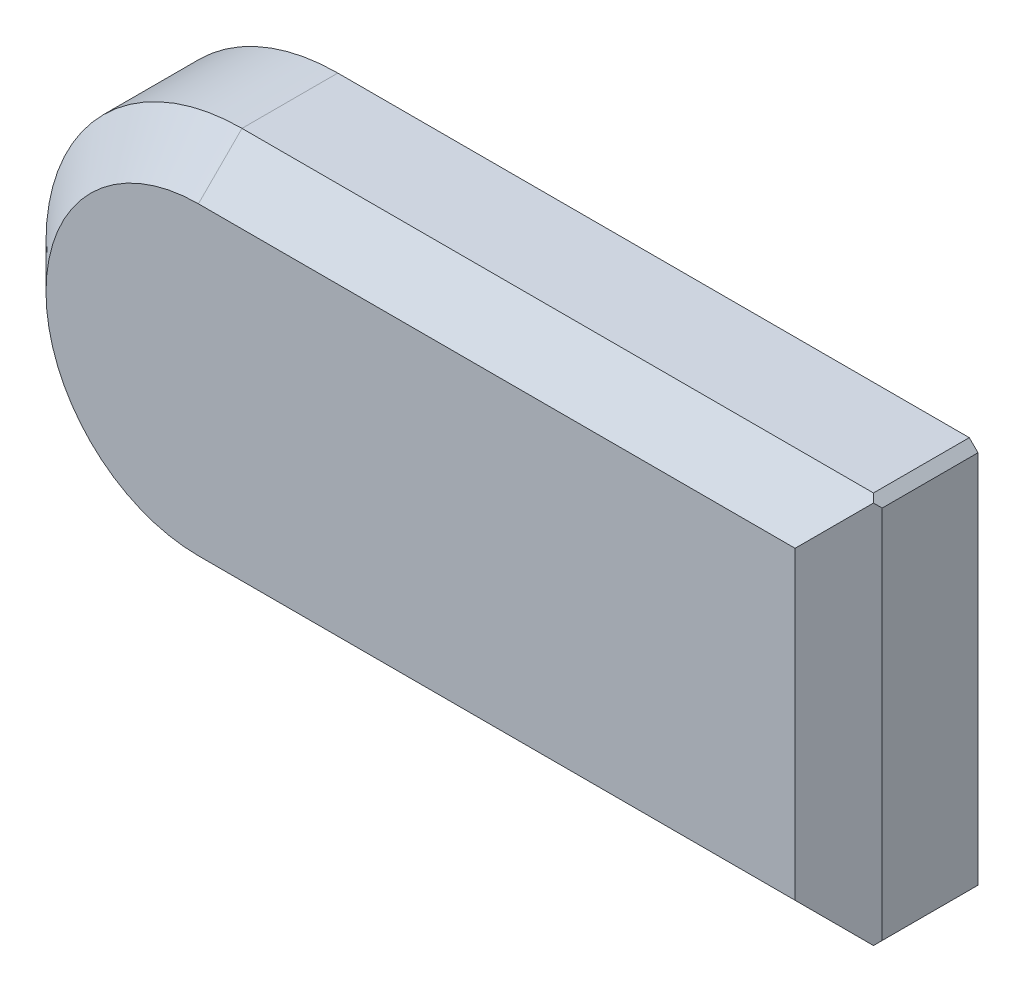
ISO-10303-21;
HEADER;
FILE_DESCRIPTION(('STEP AP214'),'2;1');
FILE_NAME('part.step','',(''),(''),'','','');
FILE_SCHEMA(('AUTOMOTIVE_DESIGN { 1 0 10303 214 1 1 1 1 }'));
ENDSEC;
DATA;
#1=APPLICATION_CONTEXT('core data for automotive mechanical design processes');
#2=APPLICATION_PROTOCOL_DEFINITION('international standard','automotive_design',2000,#1);
#3=PRODUCT_CONTEXT('',#1,'mechanical');
#4=PRODUCT('Part','Part','',(#3));
#5=PRODUCT_RELATED_PRODUCT_CATEGORY('part','',(#4));
#6=PRODUCT_DEFINITION_FORMATION('','',#4);
#7=PRODUCT_DEFINITION_CONTEXT('part definition',#1,'design');
#8=PRODUCT_DEFINITION('design','',#6,#7);
#9=PRODUCT_DEFINITION_SHAPE('','',#8);
#10=(LENGTH_UNIT() NAMED_UNIT(*) SI_UNIT(.MILLI.,.METRE.));
#11=(NAMED_UNIT(*) PLANE_ANGLE_UNIT() SI_UNIT($,.RADIAN.));
#12=(NAMED_UNIT(*) SI_UNIT($,.STERADIAN.) SOLID_ANGLE_UNIT());
#13=UNCERTAINTY_MEASURE_WITH_UNIT(LENGTH_MEASURE(1.E-05),#10,'distance_accuracy_value','');
#14=(GEOMETRIC_REPRESENTATION_CONTEXT(3) GLOBAL_UNCERTAINTY_ASSIGNED_CONTEXT((#13)) GLOBAL_UNIT_ASSIGNED_CONTEXT((#10,
#11,#12)) REPRESENTATION_CONTEXT('',''));
#15=CARTESIAN_POINT('',(0.,0.,0.));
#16=DIRECTION('',(0.,0.,1.));
#17=DIRECTION('',(1.,0.,0.));
#18=AXIS2_PLACEMENT_3D('',#15,#16,#17);
#19=CARTESIAN_POINT('',(-36.75,0.,16.));
#20=DIRECTION('',(0.,0.,-1.));
#21=DIRECTION('',(-1.,0.,0.));
#22=AXIS2_PLACEMENT_3D('',#19,#20,#21);
#23=CYLINDRICAL_SURFACE('',#22,22.5);
#24=DIRECTION('',(0.,0.,-1.));
#25=VECTOR('',#24,1.);
#26=CARTESIAN_POINT('',(-36.75,-22.5,16.));
#27=LINE('',#26,#25);
#28=CARTESIAN_POINT('',(-36.75,-22.5,11.));
#29=VERTEX_POINT('',#28);
#30=CARTESIAN_POINT('',(-36.75,-22.5,0.));
#31=VERTEX_POINT('',#30);
#32=EDGE_CURVE('E431',#29,#31,#27,.T.);
#33=ORIENTED_EDGE('',*,*,#32,.F.);
#34=CARTESIAN_POINT('',(-36.75,0.,11.));
#35=DIRECTION('',(0.,0.,1.));
#36=DIRECTION('',(1.,0.,0.));
#37=AXIS2_PLACEMENT_3D('',#34,#35,#36);
#38=CIRCLE('',#37,22.5);
#39=CARTESIAN_POINT('',(-36.75,22.5,11.));
#40=VERTEX_POINT('',#39);
#41=EDGE_CURVE('E451',#29,#40,#38,.F.);
#42=ORIENTED_EDGE('',*,*,#41,.T.);
#43=DIRECTION('',(0.,0.,-1.));
#44=VECTOR('',#43,1.);
#45=CARTESIAN_POINT('',(-36.75,22.5,16.));
#46=LINE('',#45,#44);
#47=CARTESIAN_POINT('',(-36.75,22.5,0.));
#48=VERTEX_POINT('',#47);
#49=EDGE_CURVE('E428',#40,#48,#46,.T.);
#50=ORIENTED_EDGE('',*,*,#49,.T.);
#51=CARTESIAN_POINT('',(-36.75,0.,0.));
#52=DIRECTION('',(0.,0.,1.));
#53=DIRECTION('',(1.,0.,0.));
#54=AXIS2_PLACEMENT_3D('',#51,#52,#53);
#55=CIRCLE('',#54,22.5);
#56=EDGE_CURVE('E413',#48,#31,#55,.T.);
#57=ORIENTED_EDGE('',*,*,#56,.T.);
#58=EDGE_LOOP('',(#33,#42,#50,#57));
#59=FACE_BOUND('',#58,.T.);
#60=ADVANCED_FACE('F44',(#59),#23,.T.);
#61=CARTESIAN_POINT('',(0.,-22.5,16.));
#62=DIRECTION('',(0.,1.,0.));
#63=DIRECTION('',(0.,0.,1.));
#64=AXIS2_PLACEMENT_3D('',#61,#62,#63);
#65=PLANE('',#64);
#66=DIRECTION('',(1.,0.,0.));
#67=VECTOR('',#66,1.);
#68=CARTESIAN_POINT('',(0.,-22.5,0.));
#69=LINE('',#68,#67);
#70=CARTESIAN_POINT('',(35.75,-22.5,0.));
#71=VERTEX_POINT('',#70);
#72=EDGE_CURVE('E417',#31,#71,#69,.T.);
#73=ORIENTED_EDGE('',*,*,#72,.T.);
#74=DIRECTION('',(0.,0.,1.));
#75=VECTOR('',#74,1.);
#76=CARTESIAN_POINT('',(35.75,-22.5,11.));
#77=LINE('',#76,#75);
#78=CARTESIAN_POINT('',(35.75,-22.5,11.));
#79=VERTEX_POINT('',#78);
#80=EDGE_CURVE('E54',#71,#79,#77,.T.);
#81=ORIENTED_EDGE('',*,*,#80,.T.);
#82=DIRECTION('',(-1.,0.,0.));
#83=VECTOR('',#82,1.);
#84=CARTESIAN_POINT('',(-36.75,-22.5,11.));
#85=LINE('',#84,#83);
#86=EDGE_CURVE('E448',#79,#29,#85,.T.);
#87=ORIENTED_EDGE('',*,*,#86,.T.);
#88=ORIENTED_EDGE('',*,*,#32,.T.);
#89=EDGE_LOOP('',(#73,#81,#87,#88));
#90=FACE_BOUND('',#89,.T.);
#91=ADVANCED_FACE('F527',(#90),#65,.F.);
#92=CARTESIAN_POINT('',(36.75,0.,16.));
#93=DIRECTION('',(1.,0.,0.));
#94=DIRECTION('',(0.,1.,0.));
#95=AXIS2_PLACEMENT_3D('',#92,#93,#94);
#96=PLANE('',#95);
#97=DIRECTION('',(0.,-1.,0.));
#98=VECTOR('',#97,1.);
#99=CARTESIAN_POINT('',(36.75,0.,0.));
#100=LINE('',#99,#98);
#101=CARTESIAN_POINT('',(36.75,21.5,0.));
#102=VERTEX_POINT('',#101);
#103=CARTESIAN_POINT('',(36.75,-21.5,0.));
#104=VERTEX_POINT('',#103);
#105=EDGE_CURVE('E421',#102,#104,#100,.T.);
#106=ORIENTED_EDGE('',*,*,#105,.F.);
#107=DIRECTION('',(0.,0.,1.));
#108=VECTOR('',#107,1.);
#109=CARTESIAN_POINT('',(36.75,21.5,16.));
#110=LINE('',#109,#108);
#111=CARTESIAN_POINT('',(36.75,21.5,11.));
#112=VERTEX_POINT('',#111);
#113=EDGE_CURVE('E492',#102,#112,#110,.T.);
#114=ORIENTED_EDGE('',*,*,#113,.T.);
#115=DIRECTION('',(0.,-1.,0.));
#116=VECTOR('',#115,1.);
#117=CARTESIAN_POINT('',(36.75,0.,11.));
#118=LINE('',#117,#116);
#119=CARTESIAN_POINT('',(36.75,-21.5,11.));
#120=VERTEX_POINT('',#119);
#121=EDGE_CURVE('E454',#112,#120,#118,.T.);
#122=ORIENTED_EDGE('',*,*,#121,.T.);
#123=DIRECTION('',(0.,0.,-1.));
#124=VECTOR('',#123,1.);
#125=CARTESIAN_POINT('',(36.75,-21.5,0.));
#126=LINE('',#125,#124);
#127=EDGE_CURVE('E488',#120,#104,#126,.T.);
#128=ORIENTED_EDGE('',*,*,#127,.T.);
#129=EDGE_LOOP('',(#106,#114,#122,#128));
#130=FACE_BOUND('',#129,.T.);
#131=ADVANCED_FACE('F533',(#130),#96,.T.);
#132=CARTESIAN_POINT('',(0.,22.5,16.));
#133=DIRECTION('',(0.,1.,0.));
#134=DIRECTION('',(0.,0.,1.));
#135=AXIS2_PLACEMENT_3D('',#132,#133,#134);
#136=PLANE('',#135);
#137=DIRECTION('',(1.,0.,0.));
#138=VECTOR('',#137,1.);
#139=CARTESIAN_POINT('',(0.,22.5,11.));
#140=LINE('',#139,#138);
#141=CARTESIAN_POINT('',(35.75,22.5,11.));
#142=VERTEX_POINT('',#141);
#143=EDGE_CURVE('E458',#40,#142,#140,.T.);
#144=ORIENTED_EDGE('',*,*,#143,.T.);
#145=DIRECTION('',(0.,0.,-1.));
#146=VECTOR('',#145,1.);
#147=CARTESIAN_POINT('',(35.75,22.5,16.));
#148=LINE('',#147,#146);
#149=CARTESIAN_POINT('',(35.75,22.5,0.));
#150=VERTEX_POINT('',#149);
#151=EDGE_CURVE('E478',#142,#150,#148,.T.);
#152=ORIENTED_EDGE('',*,*,#151,.T.);
#153=DIRECTION('',(1.,0.,0.));
#154=VECTOR('',#153,1.);
#155=CARTESIAN_POINT('',(0.,22.5,0.));
#156=LINE('',#155,#154);
#157=EDGE_CURVE('E424',#48,#150,#156,.T.);
#158=ORIENTED_EDGE('',*,*,#157,.F.);
#159=ORIENTED_EDGE('',*,*,#49,.F.);
#160=EDGE_LOOP('',(#144,#152,#158,#159));
#161=FACE_BOUND('',#160,.T.);
#162=ADVANCED_FACE('F602',(#161),#136,.T.);
#163=CARTESIAN_POINT('',(0.,0.,16.));
#164=DIRECTION('',(0.,0.,1.));
#165=DIRECTION('',(1.,0.,0.));
#166=AXIS2_PLACEMENT_3D('',#163,#164,#165);
#167=PLANE('',#166);
#168=CARTESIAN_POINT('',(-36.75,0.,16.));
#169=DIRECTION('',(0.,0.,1.));
#170=DIRECTION('',(1.,0.,0.));
#171=AXIS2_PLACEMENT_3D('',#168,#169,#170);
#172=CIRCLE('',#171,17.5);
#173=CARTESIAN_POINT('',(-36.75,17.5,16.));
#174=VERTEX_POINT('',#173);
#175=CARTESIAN_POINT('',(-36.75,-17.5,16.));
#176=VERTEX_POINT('',#175);
#177=EDGE_CURVE('E441',#174,#176,#172,.T.);
#178=ORIENTED_EDGE('',*,*,#177,.T.);
#179=DIRECTION('',(1.,0.,0.));
#180=VECTOR('',#179,1.);
#181=CARTESIAN_POINT('',(36.75,-17.5,16.));
#182=LINE('',#181,#180);
#183=CARTESIAN_POINT('',(31.75,-17.5,16.));
#184=VERTEX_POINT('',#183);
#185=EDGE_CURVE('E444',#176,#184,#182,.T.);
#186=ORIENTED_EDGE('',*,*,#185,.T.);
#187=DIRECTION('',(0.,1.,0.));
#188=VECTOR('',#187,1.);
#189=CARTESIAN_POINT('',(31.75,0.,16.));
#190=LINE('',#189,#188);
#191=CARTESIAN_POINT('',(31.75,17.5,16.));
#192=VERTEX_POINT('',#191);
#193=EDGE_CURVE('E437',#184,#192,#190,.T.);
#194=ORIENTED_EDGE('',*,*,#193,.T.);
#195=DIRECTION('',(-1.,0.,0.));
#196=VECTOR('',#195,1.);
#197=CARTESIAN_POINT('',(0.,17.5,16.));
#198=LINE('',#197,#196);
#199=EDGE_CURVE('E434',#192,#174,#198,.T.);
#200=ORIENTED_EDGE('',*,*,#199,.T.);
#201=EDGE_LOOP('',(#178,#186,#194,#200));
#202=FACE_BOUND('',#201,.T.);
#203=ADVANCED_FACE('F590',(#202),#167,.T.);
#204=CARTESIAN_POINT('',(0.,0.,0.));
#205=DIRECTION('',(0.,0.,1.));
#206=DIRECTION('',(1.,0.,0.));
#207=AXIS2_PLACEMENT_3D('',#204,#205,#206);
#208=PLANE('',#207);
#209=DIRECTION('',(1.,0.,0.));
#210=VECTOR('',#209,1.);
#211=CARTESIAN_POINT('',(-36.75,21.2,0.));
#212=LINE('',#211,#210);
#213=CARTESIAN_POINT('',(-36.75,21.2,0.));
#214=VERTEX_POINT('',#213);
#215=CARTESIAN_POINT('',(35.45,21.2,0.));
#216=VERTEX_POINT('',#215);
#217=EDGE_CURVE('E334',#214,#216,#212,.T.);
#218=ORIENTED_EDGE('',*,*,#217,.F.);
#219=CARTESIAN_POINT('',(-36.75,0.,0.));
#220=DIRECTION('',(0.,0.,-1.));
#221=DIRECTION('',(-1.,0.,0.));
#222=AXIS2_PLACEMENT_3D('',#219,#220,#221);
#223=CIRCLE('',#222,21.2);
#224=CARTESIAN_POINT('',(-36.75,-21.2,0.));
#225=VERTEX_POINT('',#224);
#226=EDGE_CURVE('E313',#225,#214,#223,.T.);
#227=ORIENTED_EDGE('',*,*,#226,.F.);
#228=DIRECTION('',(-1.,0.,0.));
#229=VECTOR('',#228,1.);
#230=CARTESIAN_POINT('',(-36.75,-21.2,0.));
#231=LINE('',#230,#229);
#232=CARTESIAN_POINT('',(35.45,-21.2,0.));
#233=VERTEX_POINT('',#232);
#234=EDGE_CURVE('E319',#233,#225,#231,.T.);
#235=ORIENTED_EDGE('',*,*,#234,.F.);
#236=DIRECTION('',(0.,-1.,0.));
#237=VECTOR('',#236,1.);
#238=CARTESIAN_POINT('',(35.45,21.2,0.));
#239=LINE('',#238,#237);
#240=EDGE_CURVE('E338',#216,#233,#239,.T.);
#241=ORIENTED_EDGE('',*,*,#240,.F.);
#242=EDGE_LOOP('',(#218,#227,#235,#241));
#243=FACE_BOUND('',#242,.T.);
#244=ORIENTED_EDGE('',*,*,#157,.T.);
#245=DIRECTION('',(-0.707106781186545,0.70710678118655,0.));
#246=VECTOR('',#245,1.);
#247=CARTESIAN_POINT('',(35.75,22.5,0.));
#248=LINE('',#247,#246);
#249=EDGE_CURVE('E485',#150,#102,#248,.F.);
#250=ORIENTED_EDGE('',*,*,#249,.T.);
#251=ORIENTED_EDGE('',*,*,#105,.T.);
#252=DIRECTION('',(-0.707106781186548,-0.707106781186548,0.));
#253=VECTOR('',#252,1.);
#254=CARTESIAN_POINT('',(36.75,-21.5,0.));
#255=LINE('',#254,#253);
#256=EDGE_CURVE('E482',#104,#71,#255,.T.);
#257=ORIENTED_EDGE('',*,*,#256,.T.);
#258=ORIENTED_EDGE('',*,*,#72,.F.);
#259=ORIENTED_EDGE('',*,*,#56,.F.);
#260=EDGE_LOOP('',(#244,#250,#251,#257,#258,#259));
#261=FACE_BOUND('',#260,.T.);
#262=ADVANCED_FACE('F565',(#243,#261),#208,.F.);
#263=CARTESIAN_POINT('',(0.,22.5,11.));
#264=DIRECTION('',(0.,-0.707106781186546,-0.707106781186548));
#265=DIRECTION('',(1.,0.,0.));
#266=AXIS2_PLACEMENT_3D('',#263,#264,#265);
#267=PLANE('',#266);
#268=DIRECTION('',(0.577350269189626,0.577350269189626,-0.577350269189625));
#269=VECTOR('',#268,1.);
#270=CARTESIAN_POINT('',(24.5,10.25,23.25));
#271=LINE('',#270,#269);
#272=CARTESIAN_POINT('',(36.25,22.,11.5));
#273=VERTEX_POINT('',#272);
#274=EDGE_CURVE('E469',#273,#192,#271,.F.);
#275=ORIENTED_EDGE('',*,*,#274,.F.);
#276=DIRECTION('',(-0.577350269189624,0.577350269189628,-0.577350269189626));
#277=VECTOR('',#276,1.);
#278=CARTESIAN_POINT('',(23.8333333333334,34.4166666666667,-0.916666666666625));
#279=LINE('',#278,#277);
#280=EDGE_CURVE('E501',#273,#142,#279,.T.);
#281=ORIENTED_EDGE('',*,*,#280,.T.);
#282=ORIENTED_EDGE('',*,*,#143,.F.);
#283=DIRECTION('',(0.,0.707106781186548,-0.707106781186546));
#284=VECTOR('',#283,1.);
#285=CARTESIAN_POINT('',(-36.75,17.5,16.));
#286=LINE('',#285,#284);
#287=EDGE_CURVE('E418',#174,#40,#286,.T.);
#288=ORIENTED_EDGE('',*,*,#287,.F.);
#289=ORIENTED_EDGE('',*,*,#199,.F.);
#290=EDGE_LOOP('',(#275,#281,#282,#288,#289));
#291=FACE_BOUND('',#290,.T.);
#292=ADVANCED_FACE('F560',(#291),#267,.F.);
#293=CARTESIAN_POINT('',(-36.75,0.,16.));
#294=DIRECTION('',(0.,0.,-1.));
#295=DIRECTION('',(-1.,0.,0.));
#296=AXIS2_PLACEMENT_3D('',#293,#294,#295);
#297=CONICAL_SURFACE('',#296,17.5,0.78539816339745);
#298=ORIENTED_EDGE('',*,*,#287,.T.);
#299=ORIENTED_EDGE('',*,*,#41,.F.);
#300=DIRECTION('',(0.,-0.707106781186548,-0.707106781186546));
#301=VECTOR('',#300,1.);
#302=CARTESIAN_POINT('',(-36.75,-17.5,16.));
#303=LINE('',#302,#301);
#304=EDGE_CURVE('E465',#176,#29,#303,.T.);
#305=ORIENTED_EDGE('',*,*,#304,.F.);
#306=ORIENTED_EDGE('',*,*,#177,.F.);
#307=EDGE_LOOP('',(#298,#299,#305,#306));
#308=FACE_BOUND('',#307,.T.);
#309=ADVANCED_FACE('F553',(#308),#297,.T.);
#310=CARTESIAN_POINT('',(36.75,0.,11.));
#311=DIRECTION('',(-0.707106781186546,0.,-0.707106781186548));
#312=DIRECTION('',(0.,-1.,0.));
#313=AXIS2_PLACEMENT_3D('',#310,#311,#312);
#314=PLANE('',#313);
#315=ORIENTED_EDGE('',*,*,#121,.F.);
#316=DIRECTION('',(-0.577350269189625,0.577350269189629,0.577350269189623));
#317=VECTOR('',#316,1.);
#318=CARTESIAN_POINT('',(43.9166666666667,14.3333333333333,3.83333333333333));
#319=LINE('',#318,#317);
#320=EDGE_CURVE('E498',#112,#273,#319,.T.);
#321=ORIENTED_EDGE('',*,*,#320,.T.);
#322=ORIENTED_EDGE('',*,*,#274,.T.);
#323=ORIENTED_EDGE('',*,*,#193,.F.);
#324=DIRECTION('',(-0.577350269189626,0.577350269189626,0.577350269189625));
#325=VECTOR('',#324,1.);
#326=CARTESIAN_POINT('',(29.25,-15.,18.5));
#327=LINE('',#326,#325);
#328=CARTESIAN_POINT('',(36.25,-22.,11.5));
#329=VERTEX_POINT('',#328);
#330=EDGE_CURVE('E389',#329,#184,#327,.T.);
#331=ORIENTED_EDGE('',*,*,#330,.F.);
#332=DIRECTION('',(-0.577350269189626,-0.577350269189626,0.577350269189625));
#333=VECTOR('',#332,1.);
#334=CARTESIAN_POINT('',(43.9166666666667,-14.3333333333333,3.83333333333335));
#335=LINE('',#334,#333);
#336=EDGE_CURVE('E495',#329,#120,#335,.F.);
#337=ORIENTED_EDGE('',*,*,#336,.T.);
#338=EDGE_LOOP('',(#315,#321,#322,#323,#331,#337));
#339=FACE_BOUND('',#338,.T.);
#340=ADVANCED_FACE('F547',(#339),#314,.F.);
#341=CARTESIAN_POINT('',(0.,-17.5,16.));
#342=DIRECTION('',(0.,-0.707106781186546,0.707106781186548));
#343=DIRECTION('',(-1.,0.,0.));
#344=AXIS2_PLACEMENT_3D('',#341,#342,#343);
#345=PLANE('',#344);
#346=ORIENTED_EDGE('',*,*,#86,.F.);
#347=DIRECTION('',(0.577350269189626,0.577350269189626,0.577350269189625));
#348=VECTOR('',#347,1.);
#349=CARTESIAN_POINT('',(27.1666666666667,-31.0833333333334,2.41666666666667));
#350=LINE('',#349,#348);
#351=EDGE_CURVE('E12',#79,#329,#350,.T.);
#352=ORIENTED_EDGE('',*,*,#351,.T.);
#353=ORIENTED_EDGE('',*,*,#330,.T.);
#354=ORIENTED_EDGE('',*,*,#185,.F.);
#355=ORIENTED_EDGE('',*,*,#304,.T.);
#356=EDGE_LOOP('',(#346,#352,#353,#354,#355));
#357=FACE_BOUND('',#356,.T.);
#358=ADVANCED_FACE('F539',(#357),#345,.T.);
#359=CARTESIAN_POINT('',(-36.75,0.,1.2));
#360=DIRECTION('',(0.,0.,-1.));
#361=DIRECTION('',(-1.,0.,0.));
#362=AXIS2_PLACEMENT_3D('',#359,#360,#361);
#363=CYLINDRICAL_SURFACE('',#362,21.2);
#364=ORIENTED_EDGE('',*,*,#226,.T.);
#365=DIRECTION('',(0.,0.,-1.));
#366=VECTOR('',#365,1.);
#367=CARTESIAN_POINT('',(-36.75,21.2,1.2));
#368=LINE('',#367,#366);
#369=CARTESIAN_POINT('',(-36.75,21.2,1.2));
#370=VERTEX_POINT('',#369);
#371=EDGE_CURVE('E331',#370,#214,#368,.T.);
#372=ORIENTED_EDGE('',*,*,#371,.F.);
#373=CARTESIAN_POINT('',(-36.75,0.,1.2));
#374=DIRECTION('',(0.,0.,-1.));
#375=DIRECTION('',(-1.,0.,0.));
#376=AXIS2_PLACEMENT_3D('',#373,#374,#375);
#377=CIRCLE('',#376,21.2);
#378=CARTESIAN_POINT('',(-36.75,-21.2,1.2));
#379=VERTEX_POINT('',#378);
#380=EDGE_CURVE('E314',#379,#370,#377,.T.);
#381=ORIENTED_EDGE('',*,*,#380,.F.);
#382=DIRECTION('',(0.,0.,-1.));
#383=VECTOR('',#382,1.);
#384=CARTESIAN_POINT('',(-36.75,-21.2,1.2));
#385=LINE('',#384,#383);
#386=EDGE_CURVE('E345',#379,#225,#385,.T.);
#387=ORIENTED_EDGE('',*,*,#386,.T.);
#388=EDGE_LOOP('',(#364,#372,#381,#387));
#389=FACE_BOUND('',#388,.T.);
#390=ADVANCED_FACE('F546',(#389),#363,.F.);
#391=CARTESIAN_POINT('',(-36.75,-21.2,1.2));
#392=DIRECTION('',(0.,-1.,0.));
#393=DIRECTION('',(0.,0.,-1.));
#394=AXIS2_PLACEMENT_3D('',#391,#392,#393);
#395=PLANE('',#394);
#396=ORIENTED_EDGE('',*,*,#234,.T.);
#397=ORIENTED_EDGE('',*,*,#386,.F.);
#398=DIRECTION('',(-1.,0.,0.));
#399=VECTOR('',#398,1.);
#400=CARTESIAN_POINT('',(-36.75,-21.2,1.2));
#401=LINE('',#400,#399);
#402=CARTESIAN_POINT('',(35.45,-21.2,1.2));
#403=VERTEX_POINT('',#402);
#404=EDGE_CURVE('E327',#403,#379,#401,.T.);
#405=ORIENTED_EDGE('',*,*,#404,.F.);
#406=DIRECTION('',(0.,0.,-1.));
#407=VECTOR('',#406,1.);
#408=CARTESIAN_POINT('',(35.45,-21.2,1.2));
#409=LINE('',#408,#407);
#410=EDGE_CURVE('E349',#403,#233,#409,.T.);
#411=ORIENTED_EDGE('',*,*,#410,.T.);
#412=EDGE_LOOP('',(#396,#397,#405,#411));
#413=FACE_BOUND('',#412,.T.);
#414=ADVANCED_FACE('F656',(#413),#395,.F.);
#415=CARTESIAN_POINT('',(35.45,21.2,1.2));
#416=DIRECTION('',(1.,0.,0.));
#417=DIRECTION('',(0.,1.,0.));
#418=AXIS2_PLACEMENT_3D('',#415,#416,#417);
#419=PLANE('',#418);
#420=ORIENTED_EDGE('',*,*,#240,.T.);
#421=ORIENTED_EDGE('',*,*,#410,.F.);
#422=DIRECTION('',(0.,-1.,0.));
#423=VECTOR('',#422,1.);
#424=CARTESIAN_POINT('',(35.45,21.2,1.2));
#425=LINE('',#424,#423);
#426=CARTESIAN_POINT('',(35.45,21.2,1.2));
#427=VERTEX_POINT('',#426);
#428=EDGE_CURVE('E323',#427,#403,#425,.T.);
#429=ORIENTED_EDGE('',*,*,#428,.F.);
#430=DIRECTION('',(0.,0.,-1.));
#431=VECTOR('',#430,1.);
#432=CARTESIAN_POINT('',(35.45,21.2,1.2));
#433=LINE('',#432,#431);
#434=EDGE_CURVE('E352',#427,#216,#433,.T.);
#435=ORIENTED_EDGE('',*,*,#434,.T.);
#436=EDGE_LOOP('',(#420,#421,#429,#435));
#437=FACE_BOUND('',#436,.T.);
#438=ADVANCED_FACE('F661',(#437),#419,.F.);
#439=CARTESIAN_POINT('',(-36.75,21.2,1.2));
#440=DIRECTION('',(0.,1.,0.));
#441=DIRECTION('',(0.,0.,1.));
#442=AXIS2_PLACEMENT_3D('',#439,#440,#441);
#443=PLANE('',#442);
#444=ORIENTED_EDGE('',*,*,#217,.T.);
#445=ORIENTED_EDGE('',*,*,#434,.F.);
#446=DIRECTION('',(1.,0.,0.));
#447=VECTOR('',#446,1.);
#448=CARTESIAN_POINT('',(-36.75,21.2,1.2));
#449=LINE('',#448,#447);
#450=EDGE_CURVE('E318',#370,#427,#449,.T.);
#451=ORIENTED_EDGE('',*,*,#450,.F.);
#452=ORIENTED_EDGE('',*,*,#371,.T.);
#453=EDGE_LOOP('',(#444,#445,#451,#452));
#454=FACE_BOUND('',#453,.T.);
#455=ADVANCED_FACE('F658',(#454),#443,.F.);
#456=CARTESIAN_POINT('',(-36.75,0.,1.2));
#457=DIRECTION('',(0.,0.,-1.));
#458=DIRECTION('',(-1.,0.,0.));
#459=AXIS2_PLACEMENT_3D('',#456,#457,#458);
#460=PLANE('',#459);
#461=DIRECTION('',(-1.,0.,0.));
#462=VECTOR('',#461,1.);
#463=CARTESIAN_POINT('',(-36.75,-20.,1.2));
#464=LINE('',#463,#462);
#465=CARTESIAN_POINT('',(34.25,-20.,1.2));
#466=VERTEX_POINT('',#465);
#467=CARTESIAN_POINT('',(-36.75,-20.,1.2));
#468=VERTEX_POINT('',#467);
#469=EDGE_CURVE('E309',#466,#468,#464,.T.);
#470=ORIENTED_EDGE('',*,*,#469,.F.);
#471=DIRECTION('',(0.,-1.,0.));
#472=VECTOR('',#471,1.);
#473=CARTESIAN_POINT('',(34.25,20.,1.2));
#474=LINE('',#473,#472);
#475=CARTESIAN_POINT('',(34.25,20.,1.2));
#476=VERTEX_POINT('',#475);
#477=EDGE_CURVE('E305',#476,#466,#474,.T.);
#478=ORIENTED_EDGE('',*,*,#477,.F.);
#479=DIRECTION('',(1.,0.,0.));
#480=VECTOR('',#479,1.);
#481=CARTESIAN_POINT('',(-36.75,20.,1.2));
#482=LINE('',#481,#480);
#483=CARTESIAN_POINT('',(-36.75,20.,1.2));
#484=VERTEX_POINT('',#483);
#485=EDGE_CURVE('E301',#484,#476,#482,.T.);
#486=ORIENTED_EDGE('',*,*,#485,.F.);
#487=CARTESIAN_POINT('',(-36.75,0.,1.2));
#488=DIRECTION('',(0.,0.,-1.));
#489=DIRECTION('',(-1.,0.,0.));
#490=AXIS2_PLACEMENT_3D('',#487,#488,#489);
#491=CIRCLE('',#490,20.);
#492=EDGE_CURVE('E297',#468,#484,#491,.T.);
#493=ORIENTED_EDGE('',*,*,#492,.F.);
#494=EDGE_LOOP('',(#470,#478,#486,#493));
#495=FACE_BOUND('',#494,.T.);
#496=ORIENTED_EDGE('',*,*,#380,.T.);
#497=ORIENTED_EDGE('',*,*,#450,.T.);
#498=ORIENTED_EDGE('',*,*,#428,.T.);
#499=ORIENTED_EDGE('',*,*,#404,.T.);
#500=EDGE_LOOP('',(#496,#497,#498,#499));
#501=FACE_BOUND('',#500,.T.);
#502=ADVANCED_FACE('F636',(#495,#501),#460,.T.);
#503=CARTESIAN_POINT('',(0.,0.,13.5));
#504=DIRECTION('',(0.,0.,1.));
#505=DIRECTION('',(1.,0.,0.));
#506=AXIS2_PLACEMENT_3D('',#503,#504,#505);
#507=PLANE('',#506);
#508=CARTESIAN_POINT('',(-11.25,0.,13.5));
#509=DIRECTION('',(0.,0.,1.));
#510=DIRECTION('',(1.,0.,0.));
#511=AXIS2_PLACEMENT_3D('',#508,#509,#510);
#512=CIRCLE('',#511,5.);
#513=CARTESIAN_POINT('',(-6.25,0.,13.5));
#514=VERTEX_POINT('',#513);
#515=EDGE_CURVE('E462',#514,#514,#512,.F.);
#516=ORIENTED_EDGE('',*,*,#515,.F.);
#517=EDGE_LOOP('',(#516));
#518=FACE_BOUND('',#517,.T.);
#519=CARTESIAN_POINT('',(-36.75,0.,13.5));
#520=DIRECTION('',(0.,0.,1.));
#521=DIRECTION('',(1.,0.,0.));
#522=AXIS2_PLACEMENT_3D('',#519,#520,#521);
#523=CIRCLE('',#522,16.4644660940673);
#524=CARTESIAN_POINT('',(-36.75,16.4644660940673,13.5));
#525=VERTEX_POINT('',#524);
#526=CARTESIAN_POINT('',(-36.75,-16.4644660940673,13.5));
#527=VERTEX_POINT('',#526);
#528=EDGE_CURVE('E401',#525,#527,#523,.T.);
#529=ORIENTED_EDGE('',*,*,#528,.F.);
#530=DIRECTION('',(1.,0.,0.));
#531=VECTOR('',#530,1.);
#532=CARTESIAN_POINT('',(0.,16.4644660940673,13.5));
#533=LINE('',#532,#531);
#534=CARTESIAN_POINT('',(30.7144660940673,16.4644660940673,13.5));
#535=VERTEX_POINT('',#534);
#536=EDGE_CURVE('E361',#535,#525,#533,.F.);
#537=ORIENTED_EDGE('',*,*,#536,.F.);
#538=DIRECTION('',(0.,-1.,0.));
#539=VECTOR('',#538,1.);
#540=CARTESIAN_POINT('',(30.7144660940673,0.,13.5));
#541=LINE('',#540,#539);
#542=CARTESIAN_POINT('',(30.7144660940673,-16.4644660940673,13.5));
#543=VERTEX_POINT('',#542);
#544=EDGE_CURVE('E400',#543,#535,#541,.F.);
#545=ORIENTED_EDGE('',*,*,#544,.F.);
#546=DIRECTION('',(1.,0.,0.));
#547=VECTOR('',#546,1.);
#548=CARTESIAN_POINT('',(0.,-16.4644660940673,13.5));
#549=LINE('',#548,#547);
#550=EDGE_CURVE('E380',#527,#543,#549,.T.);
#551=ORIENTED_EDGE('',*,*,#550,.F.);
#552=EDGE_LOOP('',(#529,#537,#545,#551));
#553=FACE_BOUND('',#552,.T.);
#554=ADVANCED_FACE('F628',(#518,#553),#507,.F.);
#555=CARTESIAN_POINT('',(-36.75,0.,14.2322330470336));
#556=DIRECTION('',(0.,0.,-1.));
#557=DIRECTION('',(-1.,0.,0.));
#558=AXIS2_PLACEMENT_3D('',#555,#556,#557);
#559=CONICAL_SURFACE('',#558,15.7322330470336,0.78539816339745);
#560=DIRECTION('',(0.,0.707106781186548,-0.707106781186547));
#561=VECTOR('',#560,1.);
#562=CARTESIAN_POINT('',(-36.75,15.7322330470336,14.2322330470336));
#563=LINE('',#562,#561);
#564=CARTESIAN_POINT('',(-36.75,20.,9.96446609406727));
#565=VERTEX_POINT('',#564);
#566=EDGE_CURVE('E373',#525,#565,#563,.T.);
#567=ORIENTED_EDGE('',*,*,#566,.F.);
#568=ORIENTED_EDGE('',*,*,#528,.T.);
#569=DIRECTION('',(0.,-0.707106781186548,-0.707106781186546));
#570=VECTOR('',#569,1.);
#571=CARTESIAN_POINT('',(-36.75,-15.7322330470336,14.2322330470336));
#572=LINE('',#571,#570);
#573=CARTESIAN_POINT('',(-36.75,-20.,9.96446609406726));
#574=VERTEX_POINT('',#573);
#575=EDGE_CURVE('E394',#527,#574,#572,.T.);
#576=ORIENTED_EDGE('',*,*,#575,.T.);
#577=CARTESIAN_POINT('',(-36.75,0.,9.96446609406727));
#578=DIRECTION('',(0.,0.,-1.));
#579=DIRECTION('',(-1.,0.,0.));
#580=AXIS2_PLACEMENT_3D('',#577,#578,#579);
#581=CIRCLE('',#580,20.);
#582=EDGE_CURVE('E363',#574,#565,#581,.T.);
#583=ORIENTED_EDGE('',*,*,#582,.T.);
#584=EDGE_LOOP('',(#567,#568,#576,#583));
#585=FACE_BOUND('',#584,.T.);
#586=ADVANCED_FACE('F620',(#585),#559,.F.);
#587=CARTESIAN_POINT('',(0.,-15.7322330470336,14.2322330470336));
#588=DIRECTION('',(0.,-0.707106781186546,0.707106781186548));
#589=DIRECTION('',(-1.,0.,0.));
#590=AXIS2_PLACEMENT_3D('',#587,#588,#589);
#591=PLANE('',#590);
#592=ORIENTED_EDGE('',*,*,#575,.F.);
#593=ORIENTED_EDGE('',*,*,#550,.T.);
#594=DIRECTION('',(0.577350269189626,-0.577350269189626,-0.577350269189625));
#595=VECTOR('',#594,1.);
#596=CARTESIAN_POINT('',(19.9881553646891,-5.73815536468907,24.2263107293782));
#597=LINE('',#596,#595);
#598=CARTESIAN_POINT('',(34.25,-20.,9.96446609406727));
#599=VERTEX_POINT('',#598);
#600=EDGE_CURVE('E348',#599,#543,#597,.F.);
#601=ORIENTED_EDGE('',*,*,#600,.F.);
#602=DIRECTION('',(-1.,0.,0.));
#603=VECTOR('',#602,1.);
#604=CARTESIAN_POINT('',(0.,-20.,9.96446609406727));
#605=LINE('',#604,#603);
#606=EDGE_CURVE('E367',#599,#574,#605,.T.);
#607=ORIENTED_EDGE('',*,*,#606,.T.);
#608=EDGE_LOOP('',(#592,#593,#601,#607));
#609=FACE_BOUND('',#608,.T.);
#610=ADVANCED_FACE('F616',(#609),#591,.F.);
#611=CARTESIAN_POINT('',(34.9822330470336,0.,9.23223304703364));
#612=DIRECTION('',(-0.707106781186546,0.,-0.707106781186548));
#613=DIRECTION('',(0.,-1.,0.));
#614=AXIS2_PLACEMENT_3D('',#611,#612,#613);
#615=PLANE('',#614);
#616=DIRECTION('',(-0.577350269189626,-0.577350269189626,0.577350269189625));
#617=VECTOR('',#616,1.);
#618=CARTESIAN_POINT('',(28.0714886980224,13.8214886980224,16.1429773960448));
#619=LINE('',#618,#617);
#620=CARTESIAN_POINT('',(34.25,20.,9.96446609406727));
#621=VERTEX_POINT('',#620);
#622=EDGE_CURVE('E390',#621,#535,#619,.T.);
#623=ORIENTED_EDGE('',*,*,#622,.F.);
#624=DIRECTION('',(0.,1.,0.));
#625=VECTOR('',#624,1.);
#626=CARTESIAN_POINT('',(34.25,0.,9.96446609406727));
#627=LINE('',#626,#625);
#628=EDGE_CURVE('E366',#621,#599,#627,.F.);
#629=ORIENTED_EDGE('',*,*,#628,.T.);
#630=ORIENTED_EDGE('',*,*,#600,.T.);
#631=ORIENTED_EDGE('',*,*,#544,.T.);
#632=EDGE_LOOP('',(#623,#629,#630,#631));
#633=FACE_BOUND('',#632,.T.);
#634=ADVANCED_FACE('F619',(#633),#615,.T.);
#635=CARTESIAN_POINT('',(0.,20.7322330470336,9.23223304703364));
#636=DIRECTION('',(0.,-0.707106781186546,-0.707106781186548));
#637=DIRECTION('',(1.,0.,0.));
#638=AXIS2_PLACEMENT_3D('',#635,#636,#637);
#639=PLANE('',#638);
#640=ORIENTED_EDGE('',*,*,#622,.T.);
#641=ORIENTED_EDGE('',*,*,#536,.T.);
#642=ORIENTED_EDGE('',*,*,#566,.T.);
#643=DIRECTION('',(-1.,0.,0.));
#644=VECTOR('',#643,1.);
#645=CARTESIAN_POINT('',(0.,20.,9.96446609406727));
#646=LINE('',#645,#644);
#647=EDGE_CURVE('E386',#565,#621,#646,.F.);
#648=ORIENTED_EDGE('',*,*,#647,.T.);
#649=EDGE_LOOP('',(#640,#641,#642,#648));
#650=FACE_BOUND('',#649,.T.);
#651=ADVANCED_FACE('F624',(#650),#639,.T.);
#652=CARTESIAN_POINT('',(0.,20.,16.));
#653=DIRECTION('',(0.,1.,0.));
#654=DIRECTION('',(0.,0.,1.));
#655=AXIS2_PLACEMENT_3D('',#652,#653,#654);
#656=PLANE('',#655);
#657=ORIENTED_EDGE('',*,*,#485,.T.);
#658=DIRECTION('',(0.,0.,-1.));
#659=VECTOR('',#658,1.);
#660=CARTESIAN_POINT('',(34.25,20.,16.));
#661=LINE('',#660,#659);
#662=EDGE_CURVE('E372',#621,#476,#661,.T.);
#663=ORIENTED_EDGE('',*,*,#662,.F.);
#664=ORIENTED_EDGE('',*,*,#647,.F.);
#665=DIRECTION('',(0.,0.,-1.));
#666=VECTOR('',#665,1.);
#667=CARTESIAN_POINT('',(-36.75,20.,16.));
#668=LINE('',#667,#666);
#669=EDGE_CURVE('E368',#565,#484,#668,.T.);
#670=ORIENTED_EDGE('',*,*,#669,.T.);
#671=EDGE_LOOP('',(#657,#663,#664,#670));
#672=FACE_BOUND('',#671,.T.);
#673=ADVANCED_FACE('F632',(#672),#656,.F.);
#674=CARTESIAN_POINT('',(34.25,0.,16.));
#675=DIRECTION('',(1.,0.,0.));
#676=DIRECTION('',(0.,1.,0.));
#677=AXIS2_PLACEMENT_3D('',#674,#675,#676);
#678=PLANE('',#677);
#679=ORIENTED_EDGE('',*,*,#477,.T.);
#680=DIRECTION('',(0.,0.,-1.));
#681=VECTOR('',#680,1.);
#682=CARTESIAN_POINT('',(34.25,-20.,16.));
#683=LINE('',#682,#681);
#684=EDGE_CURVE('E362',#599,#466,#683,.T.);
#685=ORIENTED_EDGE('',*,*,#684,.F.);
#686=ORIENTED_EDGE('',*,*,#628,.F.);
#687=ORIENTED_EDGE('',*,*,#662,.T.);
#688=EDGE_LOOP('',(#679,#685,#686,#687));
#689=FACE_BOUND('',#688,.T.);
#690=ADVANCED_FACE('F640',(#689),#678,.F.);
#691=CARTESIAN_POINT('',(0.,-20.,16.));
#692=DIRECTION('',(0.,1.,0.));
#693=DIRECTION('',(0.,0.,1.));
#694=AXIS2_PLACEMENT_3D('',#691,#692,#693);
#695=PLANE('',#694);
#696=ORIENTED_EDGE('',*,*,#684,.T.);
#697=ORIENTED_EDGE('',*,*,#469,.T.);
#698=DIRECTION('',(0.,0.,1.));
#699=VECTOR('',#698,1.);
#700=CARTESIAN_POINT('',(-36.75,-20.,16.));
#701=LINE('',#700,#699);
#702=EDGE_CURVE('E358',#574,#468,#701,.F.);
#703=ORIENTED_EDGE('',*,*,#702,.F.);
#704=ORIENTED_EDGE('',*,*,#606,.F.);
#705=EDGE_LOOP('',(#696,#697,#703,#704));
#706=FACE_BOUND('',#705,.T.);
#707=ADVANCED_FACE('F644',(#706),#695,.T.);
#708=CARTESIAN_POINT('',(-36.75,0.,16.));
#709=DIRECTION('',(0.,0.,-1.));
#710=DIRECTION('',(-1.,0.,0.));
#711=AXIS2_PLACEMENT_3D('',#708,#709,#710);
#712=CYLINDRICAL_SURFACE('',#711,20.);
#713=ORIENTED_EDGE('',*,*,#702,.T.);
#714=ORIENTED_EDGE('',*,*,#492,.T.);
#715=ORIENTED_EDGE('',*,*,#669,.F.);
#716=ORIENTED_EDGE('',*,*,#582,.F.);
#717=EDGE_LOOP('',(#713,#714,#715,#716));
#718=FACE_BOUND('',#717,.T.);
#719=ADVANCED_FACE('F648',(#718),#712,.F.);
#720=CARTESIAN_POINT('',(-11.25,0.,-14.142135623731));
#721=DIRECTION('',(0.,0.,1.));
#722=DIRECTION('',(1.,0.,0.));
#723=AXIS2_PLACEMENT_3D('',#720,#721,#722);
#724=CYLINDRICAL_SURFACE('',#723,5.);
#725=CARTESIAN_POINT('',(-11.25,0.,0.999999999999999));
#726=DIRECTION('',(0.,0.,1.));
#727=DIRECTION('',(1.,0.,0.));
#728=AXIS2_PLACEMENT_3D('',#725,#726,#727);
#729=CIRCLE('',#728,5.);
#730=CARTESIAN_POINT('',(-6.25,0.,0.999999999999999));
#731=VERTEX_POINT('',#730);
#732=EDGE_CURVE('E282',#731,#731,#729,.T.);
#733=ORIENTED_EDGE('',*,*,#732,.T.);
#734=EDGE_LOOP('',(#733));
#735=FACE_BOUND('',#734,.T.);
#736=ORIENTED_EDGE('',*,*,#515,.T.);
#737=EDGE_LOOP('',(#736));
#738=FACE_BOUND('',#737,.T.);
#739=ADVANCED_FACE('F652',(#735,#738),#724,.T.);
#740=CARTESIAN_POINT('',(0.,0.,1.));
#741=DIRECTION('',(0.,0.,1.));
#742=DIRECTION('',(1.,0.,0.));
#743=AXIS2_PLACEMENT_3D('',#740,#741,#742);
#744=PLANE('',#743);
#745=DIRECTION('',(-1.,0.,0.));
#746=VECTOR('',#745,1.);
#747=CARTESIAN_POINT('',(-9.66228675972853,-2.75,1.));
#748=LINE('',#747,#746);
#749=CARTESIAN_POINT('',(-9.66228675972853,-2.75,1.));
#750=VERTEX_POINT('',#749);
#751=CARTESIAN_POINT('',(-12.8377132402715,-2.75,1.));
#752=VERTEX_POINT('',#751);
#753=EDGE_CURVE('E264',#750,#752,#748,.T.);
#754=ORIENTED_EDGE('',*,*,#753,.F.);
#755=DIRECTION('',(-0.499999999999999,-0.866025403784439,0.));
#756=VECTOR('',#755,1.);
#757=CARTESIAN_POINT('',(-8.07457351945706,0.,1.));
#758=LINE('',#757,#756);
#759=CARTESIAN_POINT('',(-8.07457351945706,0.,1.));
#760=VERTEX_POINT('',#759);
#761=EDGE_CURVE('E218',#760,#750,#758,.T.);
#762=ORIENTED_EDGE('',*,*,#761,.F.);
#763=DIRECTION('',(0.5,-0.866025403784439,0.));
#764=VECTOR('',#763,1.);
#765=CARTESIAN_POINT('',(-9.66228675972853,2.75,1.));
#766=LINE('',#765,#764);
#767=CARTESIAN_POINT('',(-9.66228675972853,2.75,1.));
#768=VERTEX_POINT('',#767);
#769=EDGE_CURVE('E239',#768,#760,#766,.T.);
#770=ORIENTED_EDGE('',*,*,#769,.F.);
#771=DIRECTION('',(1.,0.,0.));
#772=VECTOR('',#771,1.);
#773=CARTESIAN_POINT('',(-12.8377132402715,2.75,1.));
#774=LINE('',#773,#772);
#775=CARTESIAN_POINT('',(-12.8377132402715,2.75,1.));
#776=VERTEX_POINT('',#775);
#777=EDGE_CURVE('E245',#776,#768,#774,.T.);
#778=ORIENTED_EDGE('',*,*,#777,.F.);
#779=DIRECTION('',(0.5,0.866025403784439,0.));
#780=VECTOR('',#779,1.);
#781=CARTESIAN_POINT('',(-14.4254264805429,0.,1.));
#782=LINE('',#781,#780);
#783=CARTESIAN_POINT('',(-14.4254264805429,0.,1.));
#784=VERTEX_POINT('',#783);
#785=EDGE_CURVE('E272',#784,#776,#782,.T.);
#786=ORIENTED_EDGE('',*,*,#785,.F.);
#787=DIRECTION('',(-0.5,0.866025403784439,0.));
#788=VECTOR('',#787,1.);
#789=CARTESIAN_POINT('',(-12.8377132402715,-2.75,1.));
#790=LINE('',#789,#788);
#791=EDGE_CURVE('E268',#752,#784,#790,.T.);
#792=ORIENTED_EDGE('',*,*,#791,.F.);
#793=EDGE_LOOP('',(#754,#762,#770,#778,#786,#792));
#794=FACE_BOUND('',#793,.T.);
#795=ORIENTED_EDGE('',*,*,#732,.F.);
#796=EDGE_LOOP('',(#795));
#797=FACE_BOUND('',#796,.T.);
#798=ADVANCED_FACE('F674',(#794,#797),#744,.F.);
#799=CARTESIAN_POINT('',(-8.07457351945706,0.,3.4));
#800=DIRECTION('',(0.866025403784439,-0.499999999999999,0.));
#801=DIRECTION('',(0.5,0.866025403784439,0.));
#802=AXIS2_PLACEMENT_3D('',#799,#800,#801);
#803=PLANE('',#802);
#804=ORIENTED_EDGE('',*,*,#761,.T.);
#805=DIRECTION('',(0.,0.,-1.));
#806=VECTOR('',#805,1.);
#807=CARTESIAN_POINT('',(-9.66228675972853,-2.75,3.4));
#808=LINE('',#807,#806);
#809=CARTESIAN_POINT('',(-9.66228675972853,-2.75,3.4));
#810=VERTEX_POINT('',#809);
#811=EDGE_CURVE('E211',#810,#750,#808,.T.);
#812=ORIENTED_EDGE('',*,*,#811,.F.);
#813=DIRECTION('',(-0.499999999999999,-0.866025403784439,0.));
#814=VECTOR('',#813,1.);
#815=CARTESIAN_POINT('',(-8.07457351945706,0.,3.4));
#816=LINE('',#815,#814);
#817=CARTESIAN_POINT('',(-8.07457351945706,0.,3.4));
#818=VERTEX_POINT('',#817);
#819=EDGE_CURVE('E215',#818,#810,#816,.T.);
#820=ORIENTED_EDGE('',*,*,#819,.F.);
#821=DIRECTION('',(0.,0.,-1.));
#822=VECTOR('',#821,1.);
#823=CARTESIAN_POINT('',(-8.07457351945706,0.,3.4));
#824=LINE('',#823,#822);
#825=EDGE_CURVE('E279',#818,#760,#824,.T.);
#826=ORIENTED_EDGE('',*,*,#825,.T.);
#827=EDGE_LOOP('',(#804,#812,#820,#826));
#828=FACE_BOUND('',#827,.T.);
#829=ADVANCED_FACE('F213',(#828),#803,.F.);
#830=CARTESIAN_POINT('',(-9.66228675972853,2.75,3.4));
#831=DIRECTION('',(0.866025403784439,0.5,0.));
#832=DIRECTION('',(-0.5,0.866025403784439,0.));
#833=AXIS2_PLACEMENT_3D('',#830,#831,#832);
#834=PLANE('',#833);
#835=ORIENTED_EDGE('',*,*,#769,.T.);
#836=ORIENTED_EDGE('',*,*,#825,.F.);
#837=DIRECTION('',(0.5,-0.866025403784439,0.));
#838=VECTOR('',#837,1.);
#839=CARTESIAN_POINT('',(-9.66228675972853,2.75,3.4));
#840=LINE('',#839,#838);
#841=CARTESIAN_POINT('',(-9.66228675972853,2.75,3.4));
#842=VERTEX_POINT('',#841);
#843=EDGE_CURVE('E224',#842,#818,#840,.T.);
#844=ORIENTED_EDGE('',*,*,#843,.F.);
#845=DIRECTION('',(0.,0.,-1.));
#846=VECTOR('',#845,1.);
#847=CARTESIAN_POINT('',(-9.66228675972853,2.75,3.4));
#848=LINE('',#847,#846);
#849=EDGE_CURVE('E283',#842,#768,#848,.T.);
#850=ORIENTED_EDGE('',*,*,#849,.T.);
#851=EDGE_LOOP('',(#835,#836,#844,#850));
#852=FACE_BOUND('',#851,.T.);
#853=ADVANCED_FACE('F680',(#852),#834,.F.);
#854=CARTESIAN_POINT('',(-12.8377132402715,2.75,3.4));
#855=DIRECTION('',(0.,1.,0.));
#856=DIRECTION('',(0.,0.,1.));
#857=AXIS2_PLACEMENT_3D('',#854,#855,#856);
#858=PLANE('',#857);
#859=ORIENTED_EDGE('',*,*,#777,.T.);
#860=ORIENTED_EDGE('',*,*,#849,.F.);
#861=DIRECTION('',(1.,0.,0.));
#862=VECTOR('',#861,1.);
#863=CARTESIAN_POINT('',(-12.8377132402715,2.75,3.4));
#864=LINE('',#863,#862);
#865=CARTESIAN_POINT('',(-12.8377132402715,2.75,3.4));
#866=VERTEX_POINT('',#865);
#867=EDGE_CURVE('E257',#866,#842,#864,.T.);
#868=ORIENTED_EDGE('',*,*,#867,.F.);
#869=DIRECTION('',(0.,0.,-1.));
#870=VECTOR('',#869,1.);
#871=CARTESIAN_POINT('',(-12.8377132402715,2.75,3.4));
#872=LINE('',#871,#870);
#873=EDGE_CURVE('E286',#866,#776,#872,.T.);
#874=ORIENTED_EDGE('',*,*,#873,.T.);
#875=EDGE_LOOP('',(#859,#860,#868,#874));
#876=FACE_BOUND('',#875,.T.);
#877=ADVANCED_FACE('F688',(#876),#858,.F.);
#878=CARTESIAN_POINT('',(-14.4254264805429,0.,3.4));
#879=DIRECTION('',(-0.866025403784439,0.5,0.));
#880=DIRECTION('',(-0.5,-0.866025403784439,0.));
#881=AXIS2_PLACEMENT_3D('',#878,#879,#880);
#882=PLANE('',#881);
#883=ORIENTED_EDGE('',*,*,#785,.T.);
#884=ORIENTED_EDGE('',*,*,#873,.F.);
#885=DIRECTION('',(0.5,0.866025403784439,0.));
#886=VECTOR('',#885,1.);
#887=CARTESIAN_POINT('',(-14.4254264805429,0.,3.4));
#888=LINE('',#887,#886);
#889=CARTESIAN_POINT('',(-14.4254264805429,0.,3.4));
#890=VERTEX_POINT('',#889);
#891=EDGE_CURVE('E253',#890,#866,#888,.T.);
#892=ORIENTED_EDGE('',*,*,#891,.F.);
#893=DIRECTION('',(0.,0.,-1.));
#894=VECTOR('',#893,1.);
#895=CARTESIAN_POINT('',(-14.4254264805429,0.,3.4));
#896=LINE('',#895,#894);
#897=EDGE_CURVE('E289',#890,#784,#896,.T.);
#898=ORIENTED_EDGE('',*,*,#897,.T.);
#899=EDGE_LOOP('',(#883,#884,#892,#898));
#900=FACE_BOUND('',#899,.T.);
#901=ADVANCED_FACE('F684',(#900),#882,.F.);
#902=CARTESIAN_POINT('',(-12.8377132402715,-2.75,3.4));
#903=DIRECTION('',(-0.866025403784439,-0.5,0.));
#904=DIRECTION('',(0.5,-0.866025403784439,0.));
#905=AXIS2_PLACEMENT_3D('',#902,#903,#904);
#906=PLANE('',#905);
#907=ORIENTED_EDGE('',*,*,#791,.T.);
#908=ORIENTED_EDGE('',*,*,#897,.F.);
#909=DIRECTION('',(-0.5,0.866025403784439,0.));
#910=VECTOR('',#909,1.);
#911=CARTESIAN_POINT('',(-12.8377132402715,-2.75,3.4));
#912=LINE('',#911,#910);
#913=CARTESIAN_POINT('',(-12.8377132402715,-2.75,3.4));
#914=VERTEX_POINT('',#913);
#915=EDGE_CURVE('E233',#914,#890,#912,.T.);
#916=ORIENTED_EDGE('',*,*,#915,.F.);
#917=DIRECTION('',(0.,0.,-1.));
#918=VECTOR('',#917,1.);
#919=CARTESIAN_POINT('',(-12.8377132402715,-2.75,3.4));
#920=LINE('',#919,#918);
#921=EDGE_CURVE('E223',#914,#752,#920,.T.);
#922=ORIENTED_EDGE('',*,*,#921,.T.);
#923=EDGE_LOOP('',(#907,#908,#916,#922));
#924=FACE_BOUND('',#923,.T.);
#925=ADVANCED_FACE('F523',(#924),#906,.F.);
#926=CARTESIAN_POINT('',(-9.66228675972853,-2.75,3.4));
#927=DIRECTION('',(0.,-1.,0.));
#928=DIRECTION('',(0.,0.,-1.));
#929=AXIS2_PLACEMENT_3D('',#926,#927,#928);
#930=PLANE('',#929);
#931=ORIENTED_EDGE('',*,*,#753,.T.);
#932=ORIENTED_EDGE('',*,*,#921,.F.);
#933=DIRECTION('',(-1.,0.,0.));
#934=VECTOR('',#933,1.);
#935=CARTESIAN_POINT('',(-9.66228675972853,-2.75,3.4));
#936=LINE('',#935,#934);
#937=EDGE_CURVE('E227',#810,#914,#936,.T.);
#938=ORIENTED_EDGE('',*,*,#937,.F.);
#939=ORIENTED_EDGE('',*,*,#811,.T.);
#940=EDGE_LOOP('',(#931,#932,#938,#939));
#941=FACE_BOUND('',#940,.T.);
#942=ADVANCED_FACE('F228',(#941),#930,.F.);
#943=CARTESIAN_POINT('',(0.,0.,3.4));
#944=DIRECTION('',(0.,0.,-1.));
#945=DIRECTION('',(-1.,0.,0.));
#946=AXIS2_PLACEMENT_3D('',#943,#944,#945);
#947=PLANE('',#946);
#948=CARTESIAN_POINT('',(-11.25,0.,3.4));
#949=DIRECTION('',(0.,0.,-1.));
#950=DIRECTION('',(-1.,0.,0.));
#951=AXIS2_PLACEMENT_3D('',#948,#949,#950);
#952=CIRCLE('',#951,1.6);
#953=CARTESIAN_POINT('',(-12.85,0.,3.4));
#954=VERTEX_POINT('',#953);
#955=EDGE_CURVE('E248',#954,#954,#952,.T.);
#956=ORIENTED_EDGE('',*,*,#955,.F.);
#957=EDGE_LOOP('',(#956));
#958=FACE_BOUND('',#957,.T.);
#959=ORIENTED_EDGE('',*,*,#819,.T.);
#960=ORIENTED_EDGE('',*,*,#937,.T.);
#961=ORIENTED_EDGE('',*,*,#915,.T.);
#962=ORIENTED_EDGE('',*,*,#891,.T.);
#963=ORIENTED_EDGE('',*,*,#867,.T.);
#964=ORIENTED_EDGE('',*,*,#843,.T.);
#965=EDGE_LOOP('',(#959,#960,#961,#962,#963,#964));
#966=FACE_BOUND('',#965,.T.);
#967=ADVANCED_FACE('F235',(#958,#966),#947,.T.);
#968=CARTESIAN_POINT('',(-11.25,0.,9.4));
#969=DIRECTION('',(0.,0.,-1.));
#970=DIRECTION('',(-1.,0.,0.));
#971=AXIS2_PLACEMENT_3D('',#968,#969,#970);
#972=CYLINDRICAL_SURFACE('',#971,1.6);
#973=CARTESIAN_POINT('',(-11.25,0.,9.4));
#974=DIRECTION('',(0.,0.,-1.));
#975=DIRECTION('',(-1.,0.,0.));
#976=AXIS2_PLACEMENT_3D('',#973,#974,#975);
#977=CIRCLE('',#976,1.6);
#978=CARTESIAN_POINT('',(-12.85,0.,9.4));
#979=VERTEX_POINT('',#978);
#980=EDGE_CURVE('E265',#979,#979,#977,.T.);
#981=ORIENTED_EDGE('',*,*,#980,.F.);
#982=EDGE_LOOP('',(#981));
#983=FACE_BOUND('',#982,.T.);
#984=ORIENTED_EDGE('',*,*,#955,.T.);
#985=EDGE_LOOP('',(#984));
#986=FACE_BOUND('',#985,.T.);
#987=ADVANCED_FACE('F512',(#983,#986),#972,.F.);
#988=CARTESIAN_POINT('',(-11.25,0.,9.4));
#989=DIRECTION('',(0.,0.,-1.));
#990=DIRECTION('',(-1.,0.,0.));
#991=AXIS2_PLACEMENT_3D('',#988,#989,#990);
#992=PLANE('',#991);
#993=ORIENTED_EDGE('',*,*,#980,.T.);
#994=EDGE_LOOP('',(#993));
#995=FACE_BOUND('',#994,.T.);
#996=ADVANCED_FACE('F510',(#995),#992,.T.);
#997=CARTESIAN_POINT('',(35.75,22.5,16.));
#998=DIRECTION('',(-0.70710678118655,-0.707106781186545,0.));
#999=DIRECTION('',(0.,0.,-1.));
#1000=AXIS2_PLACEMENT_3D('',#997,#998,#999);
#1001=PLANE('',#1000);
#1002=ORIENTED_EDGE('',*,*,#320,.F.);
#1003=ORIENTED_EDGE('',*,*,#113,.F.);
#1004=ORIENTED_EDGE('',*,*,#249,.F.);
#1005=ORIENTED_EDGE('',*,*,#151,.F.);
#1006=ORIENTED_EDGE('',*,*,#280,.F.);
#1007=EDGE_LOOP('',(#1002,#1003,#1004,#1005,#1006));
#1008=FACE_BOUND('',#1007,.T.);
#1009=ADVANCED_FACE('F567',(#1008),#1001,.F.);
#1010=CARTESIAN_POINT('',(36.75,-21.5,16.));
#1011=DIRECTION('',(0.707106781186547,-0.707106781186547,0.));
#1012=DIRECTION('',(0.,0.,1.));
#1013=AXIS2_PLACEMENT_3D('',#1010,#1011,#1012);
#1014=PLANE('',#1013);
#1015=ORIENTED_EDGE('',*,*,#351,.F.);
#1016=ORIENTED_EDGE('',*,*,#80,.F.);
#1017=ORIENTED_EDGE('',*,*,#256,.F.);
#1018=ORIENTED_EDGE('',*,*,#127,.F.);
#1019=ORIENTED_EDGE('',*,*,#336,.F.);
#1020=EDGE_LOOP('',(#1015,#1016,#1017,#1018,#1019));
#1021=FACE_BOUND('',#1020,.T.);
#1022=ADVANCED_FACE('F47',(#1021),#1014,.T.);
#1023=CLOSED_SHELL('',(#60,#91,#131,#162,#203,#262,#292,#309,#340,#358,#390,#414,#438,#455,#502,
#554,#586,#610,#634,#651,#673,#690,#707,#719,#739,#798,#829,#853,#877,#901,#925,#942,#967,#987,
#996,#1009,#1022));
#1024=MANIFOLD_SOLID_BREP('B2',#1023);
#1025=ADVANCED_BREP_SHAPE_REPRESENTATION('',(#18,#1024),#14);
#1026=SHAPE_DEFINITION_REPRESENTATION(#9,#1025);
ENDSEC;
END-ISO-10303-21;
